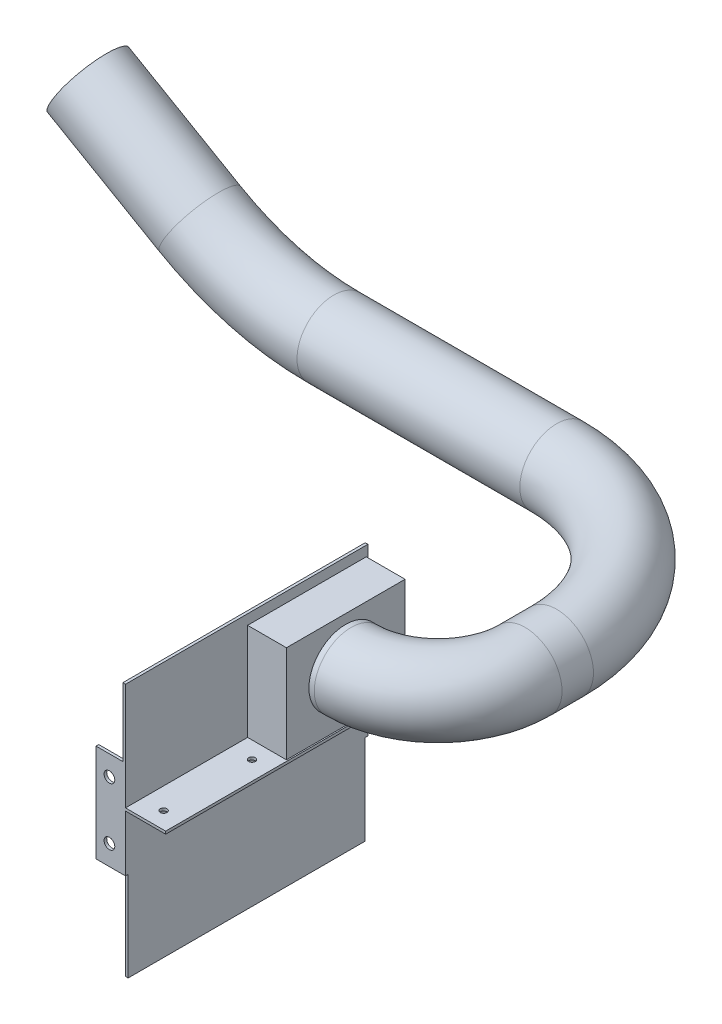
ISO-10303-21;
HEADER;
FILE_DESCRIPTION(('STEP AP214'),'2;1');
FILE_NAME('part.step','',(''),(''),'','','');
FILE_SCHEMA(('AUTOMOTIVE_DESIGN { 1 0 10303 214 1 1 1 1 }'));
ENDSEC;
DATA;
#1=APPLICATION_CONTEXT('core data for automotive mechanical design processes');
#2=APPLICATION_PROTOCOL_DEFINITION('international standard','automotive_design',2000,#1);
#3=PRODUCT_CONTEXT('',#1,'mechanical');
#4=PRODUCT('Part','Part','',(#3));
#5=PRODUCT_RELATED_PRODUCT_CATEGORY('part','',(#4));
#6=PRODUCT_DEFINITION_FORMATION('','',#4);
#7=PRODUCT_DEFINITION_CONTEXT('part definition',#1,'design');
#8=PRODUCT_DEFINITION('design','',#6,#7);
#9=PRODUCT_DEFINITION_SHAPE('','',#8);
#10=(LENGTH_UNIT() NAMED_UNIT(*) SI_UNIT(.MILLI.,.METRE.));
#11=(NAMED_UNIT(*) PLANE_ANGLE_UNIT() SI_UNIT($,.RADIAN.));
#12=(NAMED_UNIT(*) SI_UNIT($,.STERADIAN.) SOLID_ANGLE_UNIT());
#13=UNCERTAINTY_MEASURE_WITH_UNIT(LENGTH_MEASURE(1.E-05),#10,'distance_accuracy_value','');
#14=(GEOMETRIC_REPRESENTATION_CONTEXT(3) GLOBAL_UNCERTAINTY_ASSIGNED_CONTEXT((#13)) GLOBAL_UNIT_ASSIGNED_CONTEXT((#10,
#11,#12)) REPRESENTATION_CONTEXT('',''));
#15=CARTESIAN_POINT('',(0.,0.,0.));
#16=DIRECTION('',(0.,0.,1.));
#17=DIRECTION('',(1.,0.,0.));
#18=AXIS2_PLACEMENT_3D('',#15,#16,#17);
#19=CARTESIAN_POINT('',(31.,43.5,-0.7));
#20=DIRECTION('',(-1.,0.,0.));
#21=DIRECTION('',(0.,0.,1.));
#22=AXIS2_PLACEMENT_3D('',#19,#20,#21);
#23=PLANE('',#22);
#24=DIRECTION('',(0.,0.,-1.));
#25=VECTOR('',#24,1.);
#26=CARTESIAN_POINT('',(31.,-29.,-0.7));
#27=LINE('',#26,#25);
#28=CARTESIAN_POINT('',(31.,-29.,-0.699999999999992));
#29=VERTEX_POINT('',#28);
#30=CARTESIAN_POINT('',(31.,-29.,-89.3));
#31=VERTEX_POINT('',#30);
#32=EDGE_CURVE('E34',#29,#31,#27,.T.);
#33=ORIENTED_EDGE('',*,*,#32,.T.);
#34=DIRECTION('',(0.,-1.,0.));
#35=VECTOR('',#34,1.);
#36=CARTESIAN_POINT('',(31.,43.5,-89.3));
#37=LINE('',#36,#35);
#38=CARTESIAN_POINT('',(31.,43.5,-89.3));
#39=VERTEX_POINT('',#38);
#40=EDGE_CURVE('E193',#39,#31,#37,.T.);
#41=ORIENTED_EDGE('',*,*,#40,.F.);
#42=DIRECTION('',(0.,0.,-1.));
#43=VECTOR('',#42,1.);
#44=CARTESIAN_POINT('',(31.,43.5,-0.7));
#45=LINE('',#44,#43);
#46=CARTESIAN_POINT('',(31.,43.5,-0.7));
#47=VERTEX_POINT('',#46);
#48=EDGE_CURVE('E179',#47,#39,#45,.T.);
#49=ORIENTED_EDGE('',*,*,#48,.F.);
#50=DIRECTION('',(0.,-1.,0.));
#51=VECTOR('',#50,1.);
#52=CARTESIAN_POINT('',(31.,43.5,-0.7));
#53=LINE('',#52,#51);
#54=EDGE_CURVE('E171',#47,#29,#53,.T.);
#55=ORIENTED_EDGE('',*,*,#54,.T.);
#56=EDGE_LOOP('',(#33,#41,#49,#55));
#57=FACE_BOUND('',#56,.T.);
#58=CARTESIAN_POINT('',(31.,9.,-45.));
#59=DIRECTION('',(1.,0.,0.));
#60=DIRECTION('',(0.,0.,-1.));
#61=AXIS2_PLACEMENT_3D('',#58,#59,#60);
#62=CIRCLE('',#61,27.5);
#63=CARTESIAN_POINT('',(31.,9.,-72.5));
#64=VERTEX_POINT('',#63);
#65=EDGE_CURVE('E11',#64,#64,#62,.T.);
#66=ORIENTED_EDGE('',*,*,#65,.F.);
#67=EDGE_LOOP('',(#66));
#68=FACE_BOUND('',#67,.T.);
#69=ADVANCED_FACE('F17',(#57,#68),#23,.F.);
#70=CARTESIAN_POINT('',(-183.30848316431,-29.,90.5));
#71=DIRECTION('',(0.,-1.,0.));
#72=DIRECTION('',(0.,0.,-1.));
#73=AXIS2_PLACEMENT_3D('',#70,#71,#72);
#74=PLANE('',#73);
#75=CARTESIAN_POINT('',(18.,-29.,12.));
#76=DIRECTION('',(0.,1.,0.));
#77=DIRECTION('',(0.,0.,1.));
#78=AXIS2_PLACEMENT_3D('',#75,#76,#77);
#79=CIRCLE('',#78,2.5);
#80=CARTESIAN_POINT('',(18.,-29.,14.5));
#81=VERTEX_POINT('',#80);
#82=EDGE_CURVE('E241',#81,#81,#79,.T.);
#83=ORIENTED_EDGE('',*,*,#82,.F.);
#84=EDGE_LOOP('',(#83));
#85=FACE_BOUND('',#84,.T.);
#86=CARTESIAN_POINT('',(18.,-29.,78.));
#87=DIRECTION('',(0.,1.,0.));
#88=DIRECTION('',(0.,0.,1.));
#89=AXIS2_PLACEMENT_3D('',#86,#87,#88);
#90=CIRCLE('',#89,2.5);
#91=CARTESIAN_POINT('',(18.,-29.,80.5));
#92=VERTEX_POINT('',#91);
#93=EDGE_CURVE('E244',#92,#92,#90,.T.);
#94=ORIENTED_EDGE('',*,*,#93,.F.);
#95=EDGE_LOOP('',(#94));
#96=FACE_BOUND('',#95,.T.);
#97=DIRECTION('',(1.,0.,0.));
#98=VECTOR('',#97,1.);
#99=CARTESIAN_POINT('',(2.,-29.,-0.699999999999992));
#100=LINE('',#99,#98);
#101=CARTESIAN_POINT('',(2.,-29.,-0.699999999999992));
#102=VERTEX_POINT('',#101);
#103=EDGE_CURVE('E834',#102,#29,#100,.T.);
#104=ORIENTED_EDGE('',*,*,#103,.F.);
#105=DIRECTION('',(0.,0.,-1.));
#106=VECTOR('',#105,1.);
#107=CARTESIAN_POINT('',(2.,-29.,90.5));
#108=LINE('',#107,#106);
#109=CARTESIAN_POINT('',(2.,-29.,90.5));
#110=VERTEX_POINT('',#109);
#111=EDGE_CURVE('E168',#110,#102,#108,.T.);
#112=ORIENTED_EDGE('',*,*,#111,.F.);
#113=DIRECTION('',(1.,0.,0.));
#114=VECTOR('',#113,1.);
#115=CARTESIAN_POINT('',(-183.30848316431,-29.,90.5));
#116=LINE('',#115,#114);
#117=CARTESIAN_POINT('',(32.,-29.,90.5));
#118=VERTEX_POINT('',#117);
#119=EDGE_CURVE('E440',#110,#118,#116,.T.);
#120=ORIENTED_EDGE('',*,*,#119,.T.);
#121=DIRECTION('',(0.,0.,1.));
#122=VECTOR('',#121,1.);
#123=CARTESIAN_POINT('',(32.,-29.,90.5));
#124=LINE('',#123,#122);
#125=CARTESIAN_POINT('',(32.,-29.,-90.5));
#126=VERTEX_POINT('',#125);
#127=EDGE_CURVE('E264',#126,#118,#124,.T.);
#128=ORIENTED_EDGE('',*,*,#127,.F.);
#129=DIRECTION('',(1.,0.,0.));
#130=VECTOR('',#129,1.);
#131=CARTESIAN_POINT('',(-183.30848316431,-29.,-90.5));
#132=LINE('',#131,#130);
#133=CARTESIAN_POINT('',(2.,-29.,-90.5));
#134=VERTEX_POINT('',#133);
#135=EDGE_CURVE('E269',#134,#126,#132,.T.);
#136=ORIENTED_EDGE('',*,*,#135,.F.);
#137=CARTESIAN_POINT('',(2.,-29.,-89.3));
#138=VERTEX_POINT('',#137);
#139=EDGE_CURVE('E170',#138,#134,#108,.T.);
#140=ORIENTED_EDGE('',*,*,#139,.F.);
#141=DIRECTION('',(-1.,0.,0.));
#142=VECTOR('',#141,1.);
#143=CARTESIAN_POINT('',(2.,-29.,-89.3));
#144=LINE('',#143,#142);
#145=EDGE_CURVE('E39',#31,#138,#144,.T.);
#146=ORIENTED_EDGE('',*,*,#145,.F.);
#147=ORIENTED_EDGE('',*,*,#32,.F.);
#148=EDGE_LOOP('',(#104,#112,#120,#128,#136,#140,#146,#147));
#149=FACE_BOUND('',#148,.T.);
#150=ADVANCED_FACE('F294',(#85,#96,#149),#74,.F.);
#151=CARTESIAN_POINT('',(2.,51.,90.5));
#152=DIRECTION('',(-1.,0.,0.));
#153=DIRECTION('',(0.,0.,1.));
#154=AXIS2_PLACEMENT_3D('',#151,#152,#153);
#155=PLANE('',#154);
#156=DIRECTION('',(0.,-1.,0.));
#157=VECTOR('',#156,1.);
#158=CARTESIAN_POINT('',(2.,43.5,-0.699999999999992));
#159=LINE('',#158,#157);
#160=CARTESIAN_POINT('',(2.,43.5,-0.699999999999992));
#161=VERTEX_POINT('',#160);
#162=EDGE_CURVE('E161',#161,#102,#159,.T.);
#163=ORIENTED_EDGE('',*,*,#162,.F.);
#164=DIRECTION('',(0.,0.,1.));
#165=VECTOR('',#164,1.);
#166=CARTESIAN_POINT('',(2.,43.5,-0.699999999999992));
#167=LINE('',#166,#165);
#168=CARTESIAN_POINT('',(2.,43.5,-89.3));
#169=VERTEX_POINT('',#168);
#170=EDGE_CURVE('E165',#169,#161,#167,.T.);
#171=ORIENTED_EDGE('',*,*,#170,.F.);
#172=DIRECTION('',(0.,-1.,0.));
#173=VECTOR('',#172,1.);
#174=CARTESIAN_POINT('',(2.,43.5,-89.3));
#175=LINE('',#174,#173);
#176=EDGE_CURVE('E191',#169,#138,#175,.T.);
#177=ORIENTED_EDGE('',*,*,#176,.T.);
#178=ORIENTED_EDGE('',*,*,#139,.T.);
#179=DIRECTION('',(0.,-1.,0.));
#180=VECTOR('',#179,1.);
#181=CARTESIAN_POINT('',(2.,51.,-90.5));
#182=LINE('',#181,#180);
#183=CARTESIAN_POINT('',(2.,51.,-90.5));
#184=VERTEX_POINT('',#183);
#185=EDGE_CURVE('E212',#184,#134,#182,.T.);
#186=ORIENTED_EDGE('',*,*,#185,.F.);
#187=DIRECTION('',(0.,0.,-1.));
#188=VECTOR('',#187,1.);
#189=CARTESIAN_POINT('',(2.,51.,90.5));
#190=LINE('',#189,#188);
#191=CARTESIAN_POINT('',(2.,51.,90.5));
#192=VERTEX_POINT('',#191);
#193=EDGE_CURVE('E201',#192,#184,#190,.T.);
#194=ORIENTED_EDGE('',*,*,#193,.F.);
#195=DIRECTION('',(0.,-1.,0.));
#196=VECTOR('',#195,1.);
#197=CARTESIAN_POINT('',(2.,51.,90.5));
#198=LINE('',#197,#196);
#199=EDGE_CURVE('E215',#192,#110,#198,.T.);
#200=ORIENTED_EDGE('',*,*,#199,.T.);
#201=ORIENTED_EDGE('',*,*,#111,.T.);
#202=EDGE_LOOP('',(#163,#171,#177,#178,#186,#194,#200,#201));
#203=FACE_BOUND('',#202,.T.);
#204=ADVANCED_FACE('F163',(#203),#155,.F.);
#205=CARTESIAN_POINT('',(-20.,0.,90.5));
#206=DIRECTION('',(0.,1.,0.));
#207=DIRECTION('',(0.,0.,1.));
#208=AXIS2_PLACEMENT_3D('',#205,#206,#207);
#209=PLANE('',#208);
#210=DIRECTION('',(0.,0.,1.));
#211=VECTOR('',#210,1.);
#212=CARTESIAN_POINT('',(0.,0.,90.5));
#213=LINE('',#212,#211);
#214=CARTESIAN_POINT('',(0.,0.,-90.5));
#215=VERTEX_POINT('',#214);
#216=CARTESIAN_POINT('',(0.,0.,-88.5));
#217=VERTEX_POINT('',#216);
#218=EDGE_CURVE('E363',#215,#217,#213,.T.);
#219=ORIENTED_EDGE('',*,*,#218,.F.);
#220=DIRECTION('',(-1.,0.,0.));
#221=VECTOR('',#220,1.);
#222=CARTESIAN_POINT('',(2.,0.,-90.5));
#223=LINE('',#222,#221);
#224=CARTESIAN_POINT('',(-20.,0.,-90.5));
#225=VERTEX_POINT('',#224);
#226=EDGE_CURVE('E407',#215,#225,#223,.T.);
#227=ORIENTED_EDGE('',*,*,#226,.T.);
#228=DIRECTION('',(0.,0.,1.));
#229=VECTOR('',#228,1.);
#230=CARTESIAN_POINT('',(-20.,0.,-88.5));
#231=LINE('',#230,#229);
#232=CARTESIAN_POINT('',(-20.,0.,-88.5));
#233=VERTEX_POINT('',#232);
#234=EDGE_CURVE('E404',#225,#233,#231,.T.);
#235=ORIENTED_EDGE('',*,*,#234,.T.);
#236=DIRECTION('',(1.,0.,0.));
#237=VECTOR('',#236,1.);
#238=CARTESIAN_POINT('',(0.,0.,-88.5));
#239=LINE('',#238,#237);
#240=EDGE_CURVE('E402',#233,#217,#239,.T.);
#241=ORIENTED_EDGE('',*,*,#240,.T.);
#242=EDGE_LOOP('',(#219,#227,#235,#241));
#243=FACE_BOUND('',#242,.T.);
#244=ADVANCED_FACE('F316',(#243),#209,.T.);
#245=CARTESIAN_POINT('',(-20.,-140.,88.5));
#246=DIRECTION('',(-1.,0.,0.));
#247=DIRECTION('',(0.,0.,1.));
#248=AXIS2_PLACEMENT_3D('',#245,#246,#247);
#249=PLANE('',#248);
#250=DIRECTION('',(0.,0.,1.));
#251=VECTOR('',#250,1.);
#252=CARTESIAN_POINT('',(-20.,-73.,17.980499150944));
#253=LINE('',#252,#251);
#254=CARTESIAN_POINT('',(-20.,-73.,88.5));
#255=VERTEX_POINT('',#254);
#256=CARTESIAN_POINT('',(-20.,-73.,90.5));
#257=VERTEX_POINT('',#256);
#258=EDGE_CURVE('E429',#255,#257,#253,.T.);
#259=ORIENTED_EDGE('',*,*,#258,.T.);
#260=DIRECTION('',(0.,1.,0.));
#261=VECTOR('',#260,1.);
#262=CARTESIAN_POINT('',(-20.,-140.,90.5));
#263=LINE('',#262,#261);
#264=CARTESIAN_POINT('',(-20.,0.,90.5));
#265=VERTEX_POINT('',#264);
#266=EDGE_CURVE('E378',#257,#265,#263,.T.);
#267=ORIENTED_EDGE('',*,*,#266,.T.);
#268=DIRECTION('',(0.,0.,1.));
#269=VECTOR('',#268,1.);
#270=CARTESIAN_POINT('',(-20.,0.,88.5));
#271=LINE('',#270,#269);
#272=CARTESIAN_POINT('',(-20.,0.,88.5));
#273=VERTEX_POINT('',#272);
#274=EDGE_CURVE('E412',#273,#265,#271,.T.);
#275=ORIENTED_EDGE('',*,*,#274,.F.);
#276=DIRECTION('',(0.,1.,0.));
#277=VECTOR('',#276,1.);
#278=CARTESIAN_POINT('',(-20.,-140.,88.5));
#279=LINE('',#278,#277);
#280=EDGE_CURVE('E385',#255,#273,#279,.T.);
#281=ORIENTED_EDGE('',*,*,#280,.F.);
#282=EDGE_LOOP('',(#259,#267,#275,#281));
#283=FACE_BOUND('',#282,.T.);
#284=ADVANCED_FACE('F19',(#283),#249,.T.);
#285=CARTESIAN_POINT('',(-20.,-140.,88.5));
#286=DIRECTION('',(0.,0.,-1.));
#287=DIRECTION('',(-1.,0.,0.));
#288=AXIS2_PLACEMENT_3D('',#285,#286,#287);
#289=PLANE('',#288);
#290=CARTESIAN_POINT('',(-10.,-58.,88.5));
#291=DIRECTION('',(0.,0.,-1.));
#292=DIRECTION('',(-1.,0.,0.));
#293=AXIS2_PLACEMENT_3D('',#290,#291,#292);
#294=CIRCLE('',#293,4.);
#295=CARTESIAN_POINT('',(-14.,-58.,88.5));
#296=VERTEX_POINT('',#295);
#297=EDGE_CURVE('E220',#296,#296,#294,.T.);
#298=ORIENTED_EDGE('',*,*,#297,.F.);
#299=EDGE_LOOP('',(#298));
#300=FACE_BOUND('',#299,.T.);
#301=CARTESIAN_POINT('',(-10.,-15.,88.5));
#302=DIRECTION('',(0.,0.,-1.));
#303=DIRECTION('',(-1.,0.,0.));
#304=AXIS2_PLACEMENT_3D('',#301,#302,#303);
#305=CIRCLE('',#304,4.);
#306=CARTESIAN_POINT('',(-14.,-15.,88.5));
#307=VERTEX_POINT('',#306);
#308=EDGE_CURVE('E226',#307,#307,#305,.T.);
#309=ORIENTED_EDGE('',*,*,#308,.F.);
#310=EDGE_LOOP('',(#309));
#311=FACE_BOUND('',#310,.T.);
#312=DIRECTION('',(-1.,0.,0.));
#313=VECTOR('',#312,1.);
#314=CARTESIAN_POINT('',(2.,-73.,88.5));
#315=LINE('',#314,#313);
#316=CARTESIAN_POINT('',(0.,-73.,88.5));
#317=VERTEX_POINT('',#316);
#318=EDGE_CURVE('E437',#317,#255,#315,.T.);
#319=ORIENTED_EDGE('',*,*,#318,.T.);
#320=ORIENTED_EDGE('',*,*,#280,.T.);
#321=DIRECTION('',(-1.,0.,0.));
#322=VECTOR('',#321,1.);
#323=CARTESIAN_POINT('',(-20.,0.,88.5));
#324=LINE('',#323,#322);
#325=CARTESIAN_POINT('',(0.,0.,88.5));
#326=VERTEX_POINT('',#325);
#327=EDGE_CURVE('E399',#326,#273,#324,.T.);
#328=ORIENTED_EDGE('',*,*,#327,.F.);
#329=DIRECTION('',(0.,1.,0.));
#330=VECTOR('',#329,1.);
#331=CARTESIAN_POINT('',(0.,-140.,88.5));
#332=LINE('',#331,#330);
#333=EDGE_CURVE('E366',#317,#326,#332,.T.);
#334=ORIENTED_EDGE('',*,*,#333,.F.);
#335=EDGE_LOOP('',(#319,#320,#328,#334));
#336=FACE_BOUND('',#335,.T.);
#337=ADVANCED_FACE('F496',(#300,#311,#336),#289,.T.);
#338=CARTESIAN_POINT('',(0.,-140.,88.5));
#339=DIRECTION('',(-1.,0.,0.));
#340=DIRECTION('',(0.,0.,1.));
#341=AXIS2_PLACEMENT_3D('',#338,#339,#340);
#342=PLANE('',#341);
#343=ORIENTED_EDGE('',*,*,#333,.T.);
#344=DIRECTION('',(0.,0.,1.));
#345=VECTOR('',#344,1.);
#346=CARTESIAN_POINT('',(0.,0.,90.5));
#347=LINE('',#346,#345);
#348=CARTESIAN_POINT('',(0.,0.,90.5));
#349=VERTEX_POINT('',#348);
#350=EDGE_CURVE('E26',#326,#349,#347,.T.);
#351=ORIENTED_EDGE('',*,*,#350,.T.);
#352=DIRECTION('',(0.,-1.,0.));
#353=VECTOR('',#352,1.);
#354=CARTESIAN_POINT('',(0.,51.,90.5));
#355=LINE('',#354,#353);
#356=CARTESIAN_POINT('',(0.,51.,90.5));
#357=VERTEX_POINT('',#356);
#358=EDGE_CURVE('E207',#357,#349,#355,.T.);
#359=ORIENTED_EDGE('',*,*,#358,.F.);
#360=DIRECTION('',(0.,0.,1.));
#361=VECTOR('',#360,1.);
#362=CARTESIAN_POINT('',(0.,51.,90.5));
#363=LINE('',#362,#361);
#364=CARTESIAN_POINT('',(0.,51.,-90.5));
#365=VERTEX_POINT('',#364);
#366=EDGE_CURVE('E205',#365,#357,#363,.T.);
#367=ORIENTED_EDGE('',*,*,#366,.F.);
#368=DIRECTION('',(0.,-1.,0.));
#369=VECTOR('',#368,1.);
#370=CARTESIAN_POINT('',(0.,51.,-90.5));
#371=LINE('',#370,#369);
#372=EDGE_CURVE('E210',#365,#215,#371,.T.);
#373=ORIENTED_EDGE('',*,*,#372,.T.);
#374=ORIENTED_EDGE('',*,*,#218,.T.);
#375=DIRECTION('',(0.,1.,0.));
#376=VECTOR('',#375,1.);
#377=CARTESIAN_POINT('',(0.,-140.,-88.5));
#378=LINE('',#377,#376);
#379=CARTESIAN_POINT('',(0.,-73.,-88.5));
#380=VERTEX_POINT('',#379);
#381=EDGE_CURVE('E348',#380,#217,#378,.T.);
#382=ORIENTED_EDGE('',*,*,#381,.F.);
#383=CARTESIAN_POINT('',(0.,-140.,-88.5));
#384=VERTEX_POINT('',#383);
#385=EDGE_CURVE('E360',#384,#380,#378,.T.);
#386=ORIENTED_EDGE('',*,*,#385,.F.);
#387=DIRECTION('',(0.,0.,1.));
#388=VECTOR('',#387,1.);
#389=CARTESIAN_POINT('',(0.,-140.,88.5));
#390=LINE('',#389,#388);
#391=CARTESIAN_POINT('',(0.,-140.,88.5));
#392=VERTEX_POINT('',#391);
#393=EDGE_CURVE('E395',#384,#392,#390,.T.);
#394=ORIENTED_EDGE('',*,*,#393,.T.);
#395=EDGE_CURVE('E370',#392,#317,#332,.T.);
#396=ORIENTED_EDGE('',*,*,#395,.T.);
#397=EDGE_LOOP('',(#343,#351,#359,#367,#373,#374,#382,#386,#394,#396));
#398=FACE_BOUND('',#397,.T.);
#399=ADVANCED_FACE('F340',(#398),#342,.T.);
#400=CARTESIAN_POINT('',(0.,-140.,-88.5));
#401=DIRECTION('',(0.,0.,1.));
#402=DIRECTION('',(1.,0.,0.));
#403=AXIS2_PLACEMENT_3D('',#400,#401,#402);
#404=PLANE('',#403);
#405=CARTESIAN_POINT('',(-10.,-15.,-88.5));
#406=DIRECTION('',(0.,0.,1.));
#407=DIRECTION('',(1.,0.,0.));
#408=AXIS2_PLACEMENT_3D('',#405,#406,#407);
#409=CIRCLE('',#408,4.);
#410=CARTESIAN_POINT('',(-6.,-15.,-88.5));
#411=VERTEX_POINT('',#410);
#412=EDGE_CURVE('E232',#411,#411,#409,.T.);
#413=ORIENTED_EDGE('',*,*,#412,.F.);
#414=EDGE_LOOP('',(#413));
#415=FACE_BOUND('',#414,.T.);
#416=CARTESIAN_POINT('',(-10.,-58.,-88.5));
#417=DIRECTION('',(0.,0.,1.));
#418=DIRECTION('',(1.,0.,0.));
#419=AXIS2_PLACEMENT_3D('',#416,#417,#418);
#420=CIRCLE('',#419,4.);
#421=CARTESIAN_POINT('',(-6.,-58.,-88.5));
#422=VERTEX_POINT('',#421);
#423=EDGE_CURVE('E238',#422,#422,#420,.T.);
#424=ORIENTED_EDGE('',*,*,#423,.F.);
#425=EDGE_LOOP('',(#424));
#426=FACE_BOUND('',#425,.T.);
#427=DIRECTION('',(1.,0.,0.));
#428=VECTOR('',#427,1.);
#429=CARTESIAN_POINT('',(2.,-73.,-88.5));
#430=LINE('',#429,#428);
#431=CARTESIAN_POINT('',(-20.,-73.,-88.5));
#432=VERTEX_POINT('',#431);
#433=EDGE_CURVE('E345',#432,#380,#430,.T.);
#434=ORIENTED_EDGE('',*,*,#433,.T.);
#435=ORIENTED_EDGE('',*,*,#381,.T.);
#436=ORIENTED_EDGE('',*,*,#240,.F.);
#437=DIRECTION('',(0.,1.,0.));
#438=VECTOR('',#437,1.);
#439=CARTESIAN_POINT('',(-20.,-140.,-88.5));
#440=LINE('',#439,#438);
#441=EDGE_CURVE('E350',#432,#233,#440,.T.);
#442=ORIENTED_EDGE('',*,*,#441,.F.);
#443=EDGE_LOOP('',(#434,#435,#436,#442));
#444=FACE_BOUND('',#443,.T.);
#445=ADVANCED_FACE('F337',(#415,#426,#444),#404,.T.);
#446=CARTESIAN_POINT('',(-20.,-140.,-88.5));
#447=DIRECTION('',(-1.,0.,0.));
#448=DIRECTION('',(0.,0.,1.));
#449=AXIS2_PLACEMENT_3D('',#446,#447,#448);
#450=PLANE('',#449);
#451=DIRECTION('',(0.,0.,-1.));
#452=VECTOR('',#451,1.);
#453=CARTESIAN_POINT('',(-20.,-73.,-17.980499150944));
#454=LINE('',#453,#452);
#455=CARTESIAN_POINT('',(-20.,-73.,-90.5));
#456=VERTEX_POINT('',#455);
#457=EDGE_CURVE('E416',#432,#456,#454,.T.);
#458=ORIENTED_EDGE('',*,*,#457,.F.);
#459=ORIENTED_EDGE('',*,*,#441,.T.);
#460=ORIENTED_EDGE('',*,*,#234,.F.);
#461=DIRECTION('',(0.,1.,0.));
#462=VECTOR('',#461,1.);
#463=CARTESIAN_POINT('',(-20.,-140.,-90.5));
#464=LINE('',#463,#462);
#465=EDGE_CURVE('E367',#456,#225,#464,.T.);
#466=ORIENTED_EDGE('',*,*,#465,.F.);
#467=EDGE_LOOP('',(#458,#459,#460,#466));
#468=FACE_BOUND('',#467,.T.);
#469=ADVANCED_FACE('F339',(#468),#450,.T.);
#470=CARTESIAN_POINT('',(2.,-140.,-90.5));
#471=DIRECTION('',(0.,0.,-1.));
#472=DIRECTION('',(-1.,0.,0.));
#473=AXIS2_PLACEMENT_3D('',#470,#471,#472);
#474=PLANE('',#473);
#475=ORIENTED_EDGE('',*,*,#226,.F.);
#476=ORIENTED_EDGE('',*,*,#372,.F.);
#477=DIRECTION('',(-1.,0.,0.));
#478=VECTOR('',#477,1.);
#479=CARTESIAN_POINT('',(0.,51.,-90.5));
#480=LINE('',#479,#478);
#481=EDGE_CURVE('E203',#184,#365,#480,.T.);
#482=ORIENTED_EDGE('',*,*,#481,.F.);
#483=ORIENTED_EDGE('',*,*,#185,.T.);
#484=ORIENTED_EDGE('',*,*,#135,.T.);
#485=DIRECTION('',(0.,1.,0.));
#486=VECTOR('',#485,1.);
#487=CARTESIAN_POINT('',(32.,-29.,-90.5));
#488=LINE('',#487,#486);
#489=CARTESIAN_POINT('',(32.,-31.,-90.5));
#490=VERTEX_POINT('',#489);
#491=EDGE_CURVE('E446',#490,#126,#488,.T.);
#492=ORIENTED_EDGE('',*,*,#491,.F.);
#493=DIRECTION('',(-1.,0.,0.));
#494=VECTOR('',#493,1.);
#495=CARTESIAN_POINT('',(32.,-31.,-90.5));
#496=LINE('',#495,#494);
#497=CARTESIAN_POINT('',(2.,-31.,-90.5));
#498=VERTEX_POINT('',#497);
#499=EDGE_CURVE('E260',#490,#498,#496,.T.);
#500=ORIENTED_EDGE('',*,*,#499,.T.);
#501=DIRECTION('',(0.,1.,0.));
#502=VECTOR('',#501,1.);
#503=CARTESIAN_POINT('',(2.,-140.,-90.5));
#504=LINE('',#503,#502);
#505=CARTESIAN_POINT('',(2.,-73.,-90.5));
#506=VERTEX_POINT('',#505);
#507=EDGE_CURVE('E257',#506,#498,#504,.T.);
#508=ORIENTED_EDGE('',*,*,#507,.F.);
#509=DIRECTION('',(1.,0.,0.));
#510=VECTOR('',#509,1.);
#511=CARTESIAN_POINT('',(2.,-73.,-90.5));
#512=LINE('',#511,#510);
#513=EDGE_CURVE('E424',#456,#506,#512,.T.);
#514=ORIENTED_EDGE('',*,*,#513,.F.);
#515=ORIENTED_EDGE('',*,*,#465,.T.);
#516=EDGE_LOOP('',(#475,#476,#482,#483,#484,#492,#500,#508,#514,#515));
#517=FACE_BOUND('',#516,.T.);
#518=CARTESIAN_POINT('',(-10.,-15.,-90.5));
#519=DIRECTION('',(0.,0.,-1.));
#520=DIRECTION('',(-1.,0.,0.));
#521=AXIS2_PLACEMENT_3D('',#518,#519,#520);
#522=CIRCLE('',#521,4.);
#523=CARTESIAN_POINT('',(-14.,-15.,-90.5));
#524=VERTEX_POINT('',#523);
#525=EDGE_CURVE('E229',#524,#524,#522,.T.);
#526=ORIENTED_EDGE('',*,*,#525,.F.);
#527=EDGE_LOOP('',(#526));
#528=FACE_BOUND('',#527,.T.);
#529=CARTESIAN_POINT('',(-10.,-58.,-90.5));
#530=DIRECTION('',(0.,0.,-1.));
#531=DIRECTION('',(-1.,0.,0.));
#532=AXIS2_PLACEMENT_3D('',#529,#530,#531);
#533=CIRCLE('',#532,4.);
#534=CARTESIAN_POINT('',(-14.,-58.,-90.5));
#535=VERTEX_POINT('',#534);
#536=EDGE_CURVE('E235',#535,#535,#533,.T.);
#537=ORIENTED_EDGE('',*,*,#536,.F.);
#538=EDGE_LOOP('',(#537));
#539=FACE_BOUND('',#538,.T.);
#540=ADVANCED_FACE('F463',(#517,#528,#539),#474,.T.);
#541=CARTESIAN_POINT('',(2.,-140.,90.5));
#542=DIRECTION('',(1.,0.,0.));
#543=DIRECTION('',(0.,0.,-1.));
#544=AXIS2_PLACEMENT_3D('',#541,#542,#543);
#545=PLANE('',#544);
#546=DIRECTION('',(0.,0.,-1.));
#547=VECTOR('',#546,1.);
#548=CARTESIAN_POINT('',(2.,-31.,90.5));
#549=LINE('',#548,#547);
#550=CARTESIAN_POINT('',(2.,-31.,90.5));
#551=VERTEX_POINT('',#550);
#552=EDGE_CURVE('E253',#551,#498,#549,.T.);
#553=ORIENTED_EDGE('',*,*,#552,.F.);
#554=DIRECTION('',(0.,1.,0.));
#555=VECTOR('',#554,1.);
#556=CARTESIAN_POINT('',(2.,-140.,90.5));
#557=LINE('',#556,#555);
#558=CARTESIAN_POINT('',(2.,-73.,90.5));
#559=VERTEX_POINT('',#558);
#560=EDGE_CURVE('E380',#559,#551,#557,.T.);
#561=ORIENTED_EDGE('',*,*,#560,.F.);
#562=DIRECTION('',(0.,0.,1.));
#563=VECTOR('',#562,1.);
#564=CARTESIAN_POINT('',(2.,-73.,17.980499150944));
#565=LINE('',#564,#563);
#566=CARTESIAN_POINT('',(2.,-73.,88.5));
#567=VERTEX_POINT('',#566);
#568=EDGE_CURVE('E426',#567,#559,#565,.T.);
#569=ORIENTED_EDGE('',*,*,#568,.F.);
#570=DIRECTION('',(0.,1.,0.));
#571=VECTOR('',#570,1.);
#572=CARTESIAN_POINT('',(2.,-140.,88.5));
#573=LINE('',#572,#571);
#574=CARTESIAN_POINT('',(2.,-140.,88.5));
#575=VERTEX_POINT('',#574);
#576=EDGE_CURVE('E428',#575,#567,#573,.T.);
#577=ORIENTED_EDGE('',*,*,#576,.F.);
#578=DIRECTION('',(0.,0.,-1.));
#579=VECTOR('',#578,1.);
#580=CARTESIAN_POINT('',(2.,-140.,90.5));
#581=LINE('',#580,#579);
#582=CARTESIAN_POINT('',(2.,-140.,-88.5));
#583=VERTEX_POINT('',#582);
#584=EDGE_CURVE('E397',#575,#583,#581,.T.);
#585=ORIENTED_EDGE('',*,*,#584,.T.);
#586=DIRECTION('',(0.,-1.,0.));
#587=VECTOR('',#586,1.);
#588=CARTESIAN_POINT('',(2.,-140.,-88.5));
#589=LINE('',#588,#587);
#590=CARTESIAN_POINT('',(2.,-73.,-88.5));
#591=VERTEX_POINT('',#590);
#592=EDGE_CURVE('E415',#591,#583,#589,.T.);
#593=ORIENTED_EDGE('',*,*,#592,.F.);
#594=DIRECTION('',(0.,0.,-1.));
#595=VECTOR('',#594,1.);
#596=CARTESIAN_POINT('',(2.,-73.,-17.980499150944));
#597=LINE('',#596,#595);
#598=EDGE_CURVE('E354',#591,#506,#597,.T.);
#599=ORIENTED_EDGE('',*,*,#598,.T.);
#600=ORIENTED_EDGE('',*,*,#507,.T.);
#601=EDGE_LOOP('',(#553,#561,#569,#577,#585,#593,#599,#600));
#602=FACE_BOUND('',#601,.T.);
#603=ADVANCED_FACE('F482',(#602),#545,.T.);
#604=CARTESIAN_POINT('',(-20.,-140.,90.5));
#605=DIRECTION('',(0.,0.,1.));
#606=DIRECTION('',(1.,0.,0.));
#607=AXIS2_PLACEMENT_3D('',#604,#605,#606);
#608=PLANE('',#607);
#609=CARTESIAN_POINT('',(-10.,-58.,90.5));
#610=DIRECTION('',(0.,0.,1.));
#611=DIRECTION('',(1.,0.,0.));
#612=AXIS2_PLACEMENT_3D('',#609,#610,#611);
#613=CIRCLE('',#612,4.);
#614=CARTESIAN_POINT('',(-6.,-58.,90.5));
#615=VERTEX_POINT('',#614);
#616=EDGE_CURVE('E217',#615,#615,#613,.T.);
#617=ORIENTED_EDGE('',*,*,#616,.F.);
#618=EDGE_LOOP('',(#617));
#619=FACE_BOUND('',#618,.T.);
#620=CARTESIAN_POINT('',(-10.,-15.,90.5));
#621=DIRECTION('',(0.,0.,1.));
#622=DIRECTION('',(1.,0.,0.));
#623=AXIS2_PLACEMENT_3D('',#620,#621,#622);
#624=CIRCLE('',#623,4.);
#625=CARTESIAN_POINT('',(-6.,-15.,90.5));
#626=VERTEX_POINT('',#625);
#627=EDGE_CURVE('E223',#626,#626,#624,.T.);
#628=ORIENTED_EDGE('',*,*,#627,.F.);
#629=EDGE_LOOP('',(#628));
#630=FACE_BOUND('',#629,.T.);
#631=ORIENTED_EDGE('',*,*,#358,.T.);
#632=DIRECTION('',(1.,0.,0.));
#633=VECTOR('',#632,1.);
#634=CARTESIAN_POINT('',(-20.,0.,90.5));
#635=LINE('',#634,#633);
#636=EDGE_CURVE('E409',#265,#349,#635,.T.);
#637=ORIENTED_EDGE('',*,*,#636,.F.);
#638=ORIENTED_EDGE('',*,*,#266,.F.);
#639=DIRECTION('',(-1.,0.,0.));
#640=VECTOR('',#639,1.);
#641=CARTESIAN_POINT('',(2.,-73.,90.5));
#642=LINE('',#641,#640);
#643=EDGE_CURVE('E438',#559,#257,#642,.T.);
#644=ORIENTED_EDGE('',*,*,#643,.F.);
#645=ORIENTED_EDGE('',*,*,#560,.T.);
#646=DIRECTION('',(-1.,0.,0.));
#647=VECTOR('',#646,1.);
#648=CARTESIAN_POINT('',(32.,-31.,90.5));
#649=LINE('',#648,#647);
#650=CARTESIAN_POINT('',(32.,-31.,90.5));
#651=VERTEX_POINT('',#650);
#652=EDGE_CURVE('E263',#651,#551,#649,.T.);
#653=ORIENTED_EDGE('',*,*,#652,.F.);
#654=DIRECTION('',(0.,-1.,0.));
#655=VECTOR('',#654,1.);
#656=CARTESIAN_POINT('',(32.,-29.,90.5));
#657=LINE('',#656,#655);
#658=EDGE_CURVE('E250',#118,#651,#657,.T.);
#659=ORIENTED_EDGE('',*,*,#658,.F.);
#660=ORIENTED_EDGE('',*,*,#119,.F.);
#661=ORIENTED_EDGE('',*,*,#199,.F.);
#662=DIRECTION('',(1.,0.,0.));
#663=VECTOR('',#662,1.);
#664=CARTESIAN_POINT('',(0.,51.,90.5));
#665=LINE('',#664,#663);
#666=EDGE_CURVE('E198',#357,#192,#665,.T.);
#667=ORIENTED_EDGE('',*,*,#666,.F.);
#668=EDGE_LOOP('',(#631,#637,#638,#644,#645,#653,#659,#660,#661,#667));
#669=FACE_BOUND('',#668,.T.);
#670=ADVANCED_FACE('F456',(#619,#630,#669),#608,.T.);
#671=CARTESIAN_POINT('',(-20.,-140.,90.5));
#672=DIRECTION('',(0.,1.,0.));
#673=DIRECTION('',(0.,0.,1.));
#674=AXIS2_PLACEMENT_3D('',#671,#672,#673);
#675=PLANE('',#674);
#676=ORIENTED_EDGE('',*,*,#584,.F.);
#677=DIRECTION('',(-1.,0.,0.));
#678=VECTOR('',#677,1.);
#679=CARTESIAN_POINT('',(-20.,-140.,88.5));
#680=LINE('',#679,#678);
#681=EDGE_CURVE('E383',#575,#392,#680,.T.);
#682=ORIENTED_EDGE('',*,*,#681,.T.);
#683=ORIENTED_EDGE('',*,*,#393,.F.);
#684=DIRECTION('',(-1.,0.,0.));
#685=VECTOR('',#684,1.);
#686=CARTESIAN_POINT('',(2.,-140.,-88.5));
#687=LINE('',#686,#685);
#688=EDGE_CURVE('E418',#583,#384,#687,.T.);
#689=ORIENTED_EDGE('',*,*,#688,.F.);
#690=EDGE_LOOP('',(#676,#682,#683,#689));
#691=FACE_BOUND('',#690,.T.);
#692=ADVANCED_FACE('F501',(#691),#675,.F.);
#693=ORIENTED_EDGE('',*,*,#350,.F.);
#694=ORIENTED_EDGE('',*,*,#327,.T.);
#695=ORIENTED_EDGE('',*,*,#274,.T.);
#696=ORIENTED_EDGE('',*,*,#636,.T.);
#697=EDGE_LOOP('',(#693,#694,#695,#696));
#698=FACE_BOUND('',#697,.T.);
#699=ADVANCED_FACE('F477',(#698),#209,.T.);
#700=CARTESIAN_POINT('',(0.,-140.,-88.5));
#701=DIRECTION('',(0.,0.,1.));
#702=DIRECTION('',(1.,0.,0.));
#703=AXIS2_PLACEMENT_3D('',#700,#701,#702);
#704=PLANE('',#703);
#705=ORIENTED_EDGE('',*,*,#385,.T.);
#706=EDGE_CURVE('E355',#380,#591,#430,.T.);
#707=ORIENTED_EDGE('',*,*,#706,.T.);
#708=ORIENTED_EDGE('',*,*,#592,.T.);
#709=ORIENTED_EDGE('',*,*,#688,.T.);
#710=EDGE_LOOP('',(#705,#707,#708,#709));
#711=FACE_BOUND('',#710,.T.);
#712=ADVANCED_FACE('F500',(#711),#704,.F.);
#713=CARTESIAN_POINT('',(2.,-73.,-17.980499150944));
#714=DIRECTION('',(0.,1.,0.));
#715=DIRECTION('',(0.,0.,1.));
#716=AXIS2_PLACEMENT_3D('',#713,#714,#715);
#717=PLANE('',#716);
#718=ORIENTED_EDGE('',*,*,#457,.T.);
#719=ORIENTED_EDGE('',*,*,#513,.T.);
#720=ORIENTED_EDGE('',*,*,#598,.F.);
#721=ORIENTED_EDGE('',*,*,#706,.F.);
#722=ORIENTED_EDGE('',*,*,#433,.F.);
#723=EDGE_LOOP('',(#718,#719,#720,#721,#722));
#724=FACE_BOUND('',#723,.T.);
#725=ADVANCED_FACE('F505',(#724),#717,.F.);
#726=CARTESIAN_POINT('',(-20.,-140.,88.5));
#727=DIRECTION('',(0.,0.,-1.));
#728=DIRECTION('',(-1.,0.,0.));
#729=AXIS2_PLACEMENT_3D('',#726,#727,#728);
#730=PLANE('',#729);
#731=ORIENTED_EDGE('',*,*,#395,.F.);
#732=ORIENTED_EDGE('',*,*,#681,.F.);
#733=ORIENTED_EDGE('',*,*,#576,.T.);
#734=EDGE_CURVE('E432',#567,#317,#315,.T.);
#735=ORIENTED_EDGE('',*,*,#734,.T.);
#736=EDGE_LOOP('',(#731,#732,#733,#735));
#737=FACE_BOUND('',#736,.T.);
#738=ADVANCED_FACE('F537',(#737),#730,.F.);
#739=CARTESIAN_POINT('',(2.,-73.,17.980499150944));
#740=DIRECTION('',(0.,1.,0.));
#741=DIRECTION('',(0.,0.,1.));
#742=AXIS2_PLACEMENT_3D('',#739,#740,#741);
#743=PLANE('',#742);
#744=ORIENTED_EDGE('',*,*,#568,.T.);
#745=ORIENTED_EDGE('',*,*,#643,.T.);
#746=ORIENTED_EDGE('',*,*,#258,.F.);
#747=ORIENTED_EDGE('',*,*,#318,.F.);
#748=ORIENTED_EDGE('',*,*,#734,.F.);
#749=EDGE_LOOP('',(#744,#745,#746,#747,#748));
#750=FACE_BOUND('',#749,.T.);
#751=ADVANCED_FACE('F545',(#750),#743,.F.);
#752=CARTESIAN_POINT('',(32.,-31.,90.5));
#753=DIRECTION('',(0.,1.,0.));
#754=DIRECTION('',(0.,0.,1.));
#755=AXIS2_PLACEMENT_3D('',#752,#753,#754);
#756=PLANE('',#755);
#757=CARTESIAN_POINT('',(18.,-31.,12.));
#758=DIRECTION('',(0.,1.,0.));
#759=DIRECTION('',(0.,0.,1.));
#760=AXIS2_PLACEMENT_3D('',#757,#758,#759);
#761=CIRCLE('',#760,2.5);
#762=CARTESIAN_POINT('',(18.,-31.,14.5));
#763=VERTEX_POINT('',#762);
#764=EDGE_CURVE('E21',#763,#763,#761,.T.);
#765=ORIENTED_EDGE('',*,*,#764,.T.);
#766=EDGE_LOOP('',(#765));
#767=FACE_BOUND('',#766,.T.);
#768=CARTESIAN_POINT('',(18.,-31.,78.));
#769=DIRECTION('',(0.,1.,0.));
#770=DIRECTION('',(0.,0.,1.));
#771=AXIS2_PLACEMENT_3D('',#768,#769,#770);
#772=CIRCLE('',#771,2.5);
#773=CARTESIAN_POINT('',(18.,-31.,80.5));
#774=VERTEX_POINT('',#773);
#775=EDGE_CURVE('E247',#774,#774,#772,.T.);
#776=ORIENTED_EDGE('',*,*,#775,.T.);
#777=EDGE_LOOP('',(#776));
#778=FACE_BOUND('',#777,.T.);
#779=ORIENTED_EDGE('',*,*,#552,.T.);
#780=ORIENTED_EDGE('',*,*,#499,.F.);
#781=DIRECTION('',(0.,0.,-1.));
#782=VECTOR('',#781,1.);
#783=CARTESIAN_POINT('',(32.,-31.,90.5));
#784=LINE('',#783,#782);
#785=EDGE_CURVE('E448',#651,#490,#784,.T.);
#786=ORIENTED_EDGE('',*,*,#785,.F.);
#787=ORIENTED_EDGE('',*,*,#652,.T.);
#788=EDGE_LOOP('',(#779,#780,#786,#787));
#789=FACE_BOUND('',#788,.T.);
#790=ADVANCED_FACE('F274',(#767,#778,#789),#756,.F.);
#791=CARTESIAN_POINT('',(32.,-31.,90.5));
#792=DIRECTION('',(1.,0.,0.));
#793=DIRECTION('',(0.,0.,-1.));
#794=AXIS2_PLACEMENT_3D('',#791,#792,#793);
#795=PLANE('',#794);
#796=ORIENTED_EDGE('',*,*,#658,.T.);
#797=ORIENTED_EDGE('',*,*,#785,.T.);
#798=ORIENTED_EDGE('',*,*,#491,.T.);
#799=ORIENTED_EDGE('',*,*,#127,.T.);
#800=EDGE_LOOP('',(#796,#797,#798,#799));
#801=FACE_BOUND('',#800,.T.);
#802=ADVANCED_FACE('F280',(#801),#795,.T.);
#803=CARTESIAN_POINT('',(18.,-29.,78.));
#804=DIRECTION('',(0.,1.,0.));
#805=DIRECTION('',(0.,0.,1.));
#806=AXIS2_PLACEMENT_3D('',#803,#804,#805);
#807=CYLINDRICAL_SURFACE('',#806,2.5);
#808=ORIENTED_EDGE('',*,*,#93,.T.);
#809=EDGE_LOOP('',(#808));
#810=FACE_BOUND('',#809,.T.);
#811=ORIENTED_EDGE('',*,*,#775,.F.);
#812=EDGE_LOOP('',(#811));
#813=FACE_BOUND('',#812,.T.);
#814=ADVANCED_FACE('F277',(#810,#813),#807,.F.);
#815=CARTESIAN_POINT('',(18.,-29.,12.));
#816=DIRECTION('',(0.,1.,0.));
#817=DIRECTION('',(0.,0.,1.));
#818=AXIS2_PLACEMENT_3D('',#815,#816,#817);
#819=CYLINDRICAL_SURFACE('',#818,2.5);
#820=ORIENTED_EDGE('',*,*,#82,.T.);
#821=EDGE_LOOP('',(#820));
#822=FACE_BOUND('',#821,.T.);
#823=ORIENTED_EDGE('',*,*,#764,.F.);
#824=EDGE_LOOP('',(#823));
#825=FACE_BOUND('',#824,.T.);
#826=ADVANCED_FACE('F279',(#822,#825),#819,.F.);
#827=CARTESIAN_POINT('',(-10.,-58.,-90.5));
#828=DIRECTION('',(0.,0.,-1.));
#829=DIRECTION('',(-1.,0.,0.));
#830=AXIS2_PLACEMENT_3D('',#827,#828,#829);
#831=CYLINDRICAL_SURFACE('',#830,4.);
#832=ORIENTED_EDGE('',*,*,#536,.T.);
#833=EDGE_LOOP('',(#832));
#834=FACE_BOUND('',#833,.T.);
#835=ORIENTED_EDGE('',*,*,#423,.T.);
#836=EDGE_LOOP('',(#835));
#837=FACE_BOUND('',#836,.T.);
#838=ADVANCED_FACE('F287',(#834,#837),#831,.F.);
#839=CARTESIAN_POINT('',(-10.,-15.,-90.5));
#840=DIRECTION('',(0.,0.,-1.));
#841=DIRECTION('',(-1.,0.,0.));
#842=AXIS2_PLACEMENT_3D('',#839,#840,#841);
#843=CYLINDRICAL_SURFACE('',#842,4.);
#844=ORIENTED_EDGE('',*,*,#525,.T.);
#845=EDGE_LOOP('',(#844));
#846=FACE_BOUND('',#845,.T.);
#847=ORIENTED_EDGE('',*,*,#412,.T.);
#848=EDGE_LOOP('',(#847));
#849=FACE_BOUND('',#848,.T.);
#850=ADVANCED_FACE('F323',(#846,#849),#843,.F.);
#851=CARTESIAN_POINT('',(-10.,-15.,90.5));
#852=DIRECTION('',(0.,0.,1.));
#853=DIRECTION('',(1.,0.,0.));
#854=AXIS2_PLACEMENT_3D('',#851,#852,#853);
#855=CYLINDRICAL_SURFACE('',#854,4.);
#856=ORIENTED_EDGE('',*,*,#627,.T.);
#857=EDGE_LOOP('',(#856));
#858=FACE_BOUND('',#857,.T.);
#859=ORIENTED_EDGE('',*,*,#308,.T.);
#860=EDGE_LOOP('',(#859));
#861=FACE_BOUND('',#860,.T.);
#862=ADVANCED_FACE('F319',(#858,#861),#855,.F.);
#863=CARTESIAN_POINT('',(-10.,-58.,90.5));
#864=DIRECTION('',(0.,0.,1.));
#865=DIRECTION('',(1.,0.,0.));
#866=AXIS2_PLACEMENT_3D('',#863,#864,#865);
#867=CYLINDRICAL_SURFACE('',#866,4.);
#868=ORIENTED_EDGE('',*,*,#616,.T.);
#869=EDGE_LOOP('',(#868));
#870=FACE_BOUND('',#869,.T.);
#871=ORIENTED_EDGE('',*,*,#297,.T.);
#872=EDGE_LOOP('',(#871));
#873=FACE_BOUND('',#872,.T.);
#874=ADVANCED_FACE('F312',(#870,#873),#867,.F.);
#875=CARTESIAN_POINT('',(2.,51.,90.5));
#876=DIRECTION('',(0.,1.,0.));
#877=DIRECTION('',(0.,0.,1.));
#878=AXIS2_PLACEMENT_3D('',#875,#876,#877);
#879=PLANE('',#878);
#880=ORIENTED_EDGE('',*,*,#666,.T.);
#881=ORIENTED_EDGE('',*,*,#193,.T.);
#882=ORIENTED_EDGE('',*,*,#481,.T.);
#883=ORIENTED_EDGE('',*,*,#366,.T.);
#884=EDGE_LOOP('',(#880,#881,#882,#883));
#885=FACE_BOUND('',#884,.T.);
#886=ADVANCED_FACE('F309',(#885),#879,.T.);
#887=CARTESIAN_POINT('',(2.,43.5,-0.699999999999992));
#888=DIRECTION('',(0.,0.,-1.));
#889=DIRECTION('',(-1.,0.,0.));
#890=AXIS2_PLACEMENT_3D('',#887,#888,#889);
#891=PLANE('',#890);
#892=ORIENTED_EDGE('',*,*,#103,.T.);
#893=ORIENTED_EDGE('',*,*,#54,.F.);
#894=DIRECTION('',(1.,0.,0.));
#895=VECTOR('',#894,1.);
#896=CARTESIAN_POINT('',(2.,43.5,-0.699999999999992));
#897=LINE('',#896,#895);
#898=EDGE_CURVE('E174',#161,#47,#897,.T.);
#899=ORIENTED_EDGE('',*,*,#898,.F.);
#900=ORIENTED_EDGE('',*,*,#162,.T.);
#901=EDGE_LOOP('',(#892,#893,#899,#900));
#902=FACE_BOUND('',#901,.T.);
#903=ADVANCED_FACE('F175',(#902),#891,.F.);
#904=CARTESIAN_POINT('',(2.,43.5,-89.3));
#905=DIRECTION('',(0.,0.,1.));
#906=DIRECTION('',(1.,0.,0.));
#907=AXIS2_PLACEMENT_3D('',#904,#905,#906);
#908=PLANE('',#907);
#909=ORIENTED_EDGE('',*,*,#145,.T.);
#910=ORIENTED_EDGE('',*,*,#176,.F.);
#911=DIRECTION('',(-1.,0.,0.));
#912=VECTOR('',#911,1.);
#913=CARTESIAN_POINT('',(2.,43.5,-89.3));
#914=LINE('',#913,#912);
#915=EDGE_CURVE('E183',#39,#169,#914,.T.);
#916=ORIENTED_EDGE('',*,*,#915,.F.);
#917=ORIENTED_EDGE('',*,*,#40,.T.);
#918=EDGE_LOOP('',(#909,#910,#916,#917));
#919=FACE_BOUND('',#918,.T.);
#920=ADVANCED_FACE('F305',(#919),#908,.F.);
#921=CARTESIAN_POINT('',(2.,43.5,-0.699999999999992));
#922=DIRECTION('',(0.,-1.,0.));
#923=DIRECTION('',(0.,0.,-1.));
#924=AXIS2_PLACEMENT_3D('',#921,#922,#923);
#925=PLANE('',#924);
#926=ORIENTED_EDGE('',*,*,#170,.T.);
#927=ORIENTED_EDGE('',*,*,#898,.T.);
#928=ORIENTED_EDGE('',*,*,#48,.T.);
#929=ORIENTED_EDGE('',*,*,#915,.T.);
#930=EDGE_LOOP('',(#926,#927,#928,#929));
#931=FACE_BOUND('',#930,.T.);
#932=ADVANCED_FACE('F181',(#931),#925,.F.);
#933=CARTESIAN_POINT('',(-20.,9.,-253.5));
#934=DIRECTION('',(-1.,0.,0.));
#935=DIRECTION('',(0.,0.,1.));
#936=AXIS2_PLACEMENT_3D('',#933,#934,#935);
#937=CYLINDRICAL_SURFACE('',#936,27.5);
#938=CARTESIAN_POINT('',(-20.,9.,-253.5));
#939=DIRECTION('',(-1.,0.,0.));
#940=DIRECTION('',(0.,0.,1.));
#941=AXIS2_PLACEMENT_3D('',#938,#939,#940);
#942=CIRCLE('',#941,27.5);
#943=CARTESIAN_POINT('',(-20.,9.,-281.));
#944=VERTEX_POINT('',#943);
#945=EDGE_CURVE('E831',#944,#944,#942,.T.);
#946=ORIENTED_EDGE('',*,*,#945,.T.);
#947=EDGE_LOOP('',(#946));
#948=FACE_BOUND('',#947,.T.);
#949=CARTESIAN_POINT('',(-186.410161513776,9.,-253.5));
#950=DIRECTION('',(-1.,0.,0.));
#951=DIRECTION('',(0.,0.,1.));
#952=AXIS2_PLACEMENT_3D('',#949,#950,#951);
#953=CIRCLE('',#952,27.5);
#954=CARTESIAN_POINT('',(-186.410161513776,-18.5,-253.5));
#955=VERTEX_POINT('',#954);
#956=EDGE_CURVE('E822',#955,#955,#953,.T.);
#957=ORIENTED_EDGE('',*,*,#956,.F.);
#958=EDGE_LOOP('',(#957));
#959=FACE_BOUND('',#958,.T.);
#960=ADVANCED_FACE('F576',(#948,#959),#937,.T.);
#961=CARTESIAN_POINT('',(-20.,9.,-133.5));
#962=DIRECTION('',(0.,1.,0.));
#963=DIRECTION('',(0.,0.,1.));
#964=AXIS2_PLACEMENT_3D('',#961,#962,#963);
#965=TOROIDAL_SURFACE('',#964,120.,27.5);
#966=CARTESIAN_POINT('',(100.,9.,-133.5));
#967=DIRECTION('',(0.,0.,-1.));
#968=DIRECTION('',(-1.,0.,0.));
#969=AXIS2_PLACEMENT_3D('',#966,#967,#968);
#970=CIRCLE('',#969,27.5);
#971=CARTESIAN_POINT('',(127.5,9.,-133.5));
#972=VERTEX_POINT('',#971);
#973=EDGE_CURVE('E828',#972,#972,#970,.T.);
#974=CARTESIAN_POINT('',(-20.,9.,-133.5));
#975=DIRECTION('',(0.,1.,0.));
#976=DIRECTION('',(0.,0.,1.));
#977=AXIS2_PLACEMENT_3D('',#974,#975,#976);
#978=CIRCLE('',#977,147.5);
#979=EDGE_CURVE('',#972,#944,#978,.T.);
#980=ORIENTED_EDGE('',*,*,#973,.T.);
#981=ORIENTED_EDGE('',*,*,#945,.F.);
#982=ORIENTED_EDGE('',*,*,#979,.T.);
#983=ORIENTED_EDGE('',*,*,#979,.F.);
#984=EDGE_LOOP('',(#980,#982,#981,#983));
#985=FACE_BOUND('',#984,.T.);
#986=ADVANCED_FACE('F584',(#985),#965,.T.);
#987=CARTESIAN_POINT('',(100.,9.,-110.));
#988=DIRECTION('',(0.,0.,-1.));
#989=DIRECTION('',(-1.,0.,0.));
#990=AXIS2_PLACEMENT_3D('',#987,#988,#989);
#991=CYLINDRICAL_SURFACE('',#990,27.5);
#992=CARTESIAN_POINT('',(100.,9.,-110.));
#993=DIRECTION('',(0.,0.,-1.));
#994=DIRECTION('',(-1.,0.,0.));
#995=AXIS2_PLACEMENT_3D('',#992,#993,#994);
#996=CIRCLE('',#995,27.5);
#997=CARTESIAN_POINT('',(127.5,9.,-110.));
#998=VERTEX_POINT('',#997);
#999=EDGE_CURVE('E819',#998,#998,#996,.T.);
#1000=ORIENTED_EDGE('',*,*,#999,.T.);
#1001=EDGE_LOOP('',(#1000));
#1002=FACE_BOUND('',#1001,.T.);
#1003=ORIENTED_EDGE('',*,*,#973,.F.);
#1004=EDGE_LOOP('',(#1003));
#1005=FACE_BOUND('',#1004,.T.);
#1006=ADVANCED_FACE('F596',(#1002,#1005),#991,.T.);
#1007=CARTESIAN_POINT('',(35.,9.,-110.));
#1008=DIRECTION('',(0.,1.,0.));
#1009=DIRECTION('',(0.,0.,1.));
#1010=AXIS2_PLACEMENT_3D('',#1007,#1008,#1009);
#1011=TOROIDAL_SURFACE('',#1010,65.,27.5);
#1012=CARTESIAN_POINT('',(35.,9.,-45.));
#1013=DIRECTION('',(1.,0.,0.));
#1014=DIRECTION('',(0.,0.,-1.));
#1015=AXIS2_PLACEMENT_3D('',#1012,#1013,#1014);
#1016=CIRCLE('',#1015,27.5);
#1017=CARTESIAN_POINT('',(35.,9.,-17.5));
#1018=VERTEX_POINT('',#1017);
#1019=EDGE_CURVE('E815',#1018,#1018,#1016,.T.);
#1020=CARTESIAN_POINT('',(35.,9.,-110.));
#1021=DIRECTION('',(0.,1.,0.));
#1022=DIRECTION('',(0.,0.,1.));
#1023=AXIS2_PLACEMENT_3D('',#1020,#1021,#1022);
#1024=CIRCLE('',#1023,92.5);
#1025=EDGE_CURVE('',#1018,#998,#1024,.T.);
#1026=ORIENTED_EDGE('',*,*,#1019,.T.);
#1027=ORIENTED_EDGE('',*,*,#999,.F.);
#1028=ORIENTED_EDGE('',*,*,#1025,.T.);
#1029=ORIENTED_EDGE('',*,*,#1025,.F.);
#1030=EDGE_LOOP('',(#1026,#1028,#1027,#1029));
#1031=FACE_BOUND('',#1030,.T.);
#1032=ADVANCED_FACE('F607',(#1031),#1011,.T.);
#1033=CARTESIAN_POINT('',(35.,9.,-45.));
#1034=DIRECTION('',(-1.,0.,0.));
#1035=DIRECTION('',(0.,0.,1.));
#1036=AXIS2_PLACEMENT_3D('',#1033,#1034,#1035);
#1037=CYLINDRICAL_SURFACE('',#1036,27.5);
#1038=ORIENTED_EDGE('',*,*,#1019,.F.);
#1039=EDGE_LOOP('',(#1038));
#1040=FACE_BOUND('',#1039,.T.);
#1041=ORIENTED_EDGE('',*,*,#65,.T.);
#1042=EDGE_LOOP('',(#1041));
#1043=FACE_BOUND('',#1042,.T.);
#1044=ADVANCED_FACE('F618',(#1040,#1043),#1037,.T.);
#1045=CARTESIAN_POINT('',(-286.410161513776,35.7949192431123,-253.5));
#1046=DIRECTION('',(-0.866025403784438,0.5,0.));
#1047=DIRECTION('',(-0.5,-0.866025403784438,0.));
#1048=AXIS2_PLACEMENT_3D('',#1045,#1046,#1047);
#1049=CYLINDRICAL_SURFACE('',#1048,27.5);
#1050=CARTESIAN_POINT('',(-286.410161513776,35.7949192431123,-253.5));
#1051=DIRECTION('',(-0.866025403784438,0.5,0.));
#1052=DIRECTION('',(0.,0.,1.));
#1053=AXIS2_PLACEMENT_3D('',#1050,#1051,#1052);
#1054=CIRCLE('',#1053,27.5);
#1055=CARTESIAN_POINT('',(-300.160161513776,11.9792206390403,-253.5));
#1056=VERTEX_POINT('',#1055);
#1057=EDGE_CURVE('E816',#1056,#1056,#1054,.T.);
#1058=CARTESIAN_POINT('',(-369.903810567666,84.,-253.5));
#1059=DIRECTION('',(-0.866025403784438,0.5,0.));
#1060=DIRECTION('',(0.,0.,1.));
#1061=AXIS2_PLACEMENT_3D('',#1058,#1059,#1060);
#1062=CIRCLE('',#1061,27.5);
#1063=CARTESIAN_POINT('',(-383.653810567666,60.1843013959279,-253.5));
#1064=VERTEX_POINT('',#1063);
#1065=EDGE_CURVE('E813',#1064,#1064,#1062,.T.);
#1066=CARTESIAN_POINT('',(-300.160161513776,11.9792206390403,-253.5));
#1067=CARTESIAN_POINT('',(-301.029887024754,12.4813568969246,-253.5));
#1068=CARTESIAN_POINT('',(-301.899612535732,12.9834931548088,-253.5));
#1069=CARTESIAN_POINT('',(-303.639063557688,13.9877656705773,-253.5));
#1070=CARTESIAN_POINT('',(-304.508789068666,14.4899019284615,-253.5));
#1071=CARTESIAN_POINT('',(-306.248240090622,15.49417444423,-253.5));
#1072=CARTESIAN_POINT('',(-307.1179656016,15.9963107021143,-253.5));
#1073=CARTESIAN_POINT('',(-308.857416623556,17.0005832178828,-253.5));
#1074=CARTESIAN_POINT('',(-309.727142134534,17.502719475767,-253.5));
#1075=CARTESIAN_POINT('',(-311.46659315649,18.5069919915355,-253.5));
#1076=CARTESIAN_POINT('',(-312.336318667468,19.0091282494198,-253.5));
#1077=CARTESIAN_POINT('',(-314.075769689424,20.0134007651882,-253.5));
#1078=CARTESIAN_POINT('',(-314.945495200402,20.5155370230725,-253.5));
#1079=CARTESIAN_POINT('',(-316.684946222358,21.519809538841,-253.5));
#1080=CARTESIAN_POINT('',(-317.554671733336,22.0219457967252,-253.5));
#1081=CARTESIAN_POINT('',(-319.294122755292,23.0262183124937,-253.5));
#1082=CARTESIAN_POINT('',(-320.16384826627,23.528354570378,-253.5));
#1083=CARTESIAN_POINT('',(-321.903299288226,24.5326270861465,-253.5));
#1084=CARTESIAN_POINT('',(-322.773024799204,25.0347633440307,-253.5));
#1085=CARTESIAN_POINT('',(-324.51247582116,26.0390358597992,-253.5));
#1086=CARTESIAN_POINT('',(-325.382201332138,26.5411721176834,-253.5));
#1087=CARTESIAN_POINT('',(-327.121652354094,27.5454446334519,-253.5));
#1088=CARTESIAN_POINT('',(-327.991377865072,28.0475808913362,-253.5));
#1089=CARTESIAN_POINT('',(-329.730828887028,29.0518534071047,-253.5));
#1090=CARTESIAN_POINT('',(-330.600554398006,29.5539896649889,-253.5));
#1091=CARTESIAN_POINT('',(-332.340005419962,30.5582621807574,-253.5));
#1092=CARTESIAN_POINT('',(-333.20973093094,31.0603984386417,-253.5));
#1093=CARTESIAN_POINT('',(-334.949181952896,32.0646709544101,-253.5));
#1094=CARTESIAN_POINT('',(-335.818907463874,32.5668072122944,-253.5));
#1095=CARTESIAN_POINT('',(-337.55835848583,33.5710797280629,-253.5));
#1096=CARTESIAN_POINT('',(-338.428083996808,34.0732159859471,-253.5));
#1097=CARTESIAN_POINT('',(-340.167535018765,35.0774885017156,-253.5));
#1098=CARTESIAN_POINT('',(-341.037260529743,35.5796247595999,-253.5));
#1099=CARTESIAN_POINT('',(-342.776711551699,36.5838972753684,-253.5));
#1100=CARTESIAN_POINT('',(-343.646437062677,37.0860335332526,-253.5));
#1101=CARTESIAN_POINT('',(-345.385888084633,38.0903060490211,-253.5));
#1102=CARTESIAN_POINT('',(-346.255613595611,38.5924423069053,-253.5));
#1103=CARTESIAN_POINT('',(-347.995064617567,39.5967148226738,-253.5));
#1104=CARTESIAN_POINT('',(-348.864790128545,40.0988510805581,-253.5));
#1105=CARTESIAN_POINT('',(-350.604241150501,41.1031235963266,-253.5));
#1106=CARTESIAN_POINT('',(-351.473966661479,41.6052598542108,-253.5));
#1107=CARTESIAN_POINT('',(-353.213417683435,42.6095323699793,-253.5));
#1108=CARTESIAN_POINT('',(-354.083143194413,43.1116686278635,-253.5));
#1109=CARTESIAN_POINT('',(-355.822594216369,44.115941143632,-253.5));
#1110=CARTESIAN_POINT('',(-356.692319727347,44.6180774015163,-253.5));
#1111=CARTESIAN_POINT('',(-358.431770749303,45.6223499172848,-253.5));
#1112=CARTESIAN_POINT('',(-359.301496260281,46.124486175169,-253.5));
#1113=CARTESIAN_POINT('',(-361.040947282237,47.1287586909375,-253.5));
#1114=CARTESIAN_POINT('',(-361.910672793215,47.6308949488218,-253.5));
#1115=CARTESIAN_POINT('',(-363.650123815171,48.6351674645902,-253.5));
#1116=CARTESIAN_POINT('',(-364.519849326149,49.1373037224745,-253.5));
#1117=CARTESIAN_POINT('',(-366.259300348105,50.141576238243,-253.5));
#1118=CARTESIAN_POINT('',(-367.129025859083,50.6437124961272,-253.5));
#1119=CARTESIAN_POINT('',(-368.868476881039,51.6479850118957,-253.5));
#1120=CARTESIAN_POINT('',(-369.738202392017,52.15012126978,-253.5));
#1121=CARTESIAN_POINT('',(-371.477653413973,53.1543937855485,-253.5));
#1122=CARTESIAN_POINT('',(-372.347378924951,53.6565300434327,-253.5));
#1123=CARTESIAN_POINT('',(-374.086829946907,54.6608025592012,-253.5));
#1124=CARTESIAN_POINT('',(-374.956555457885,55.1629388170854,-253.5));
#1125=CARTESIAN_POINT('',(-376.696006479841,56.1672113328539,-253.5));
#1126=CARTESIAN_POINT('',(-377.565731990819,56.6693475907382,-253.5));
#1127=CARTESIAN_POINT('',(-379.305183012775,57.6736201065067,-253.5));
#1128=CARTESIAN_POINT('',(-380.174908523753,58.1757563643909,-253.5));
#1129=CARTESIAN_POINT('',(-381.914359545709,59.1800288801594,-253.5));
#1130=CARTESIAN_POINT('',(-382.784085056688,59.6821651380437,-253.5));
#1131=CARTESIAN_POINT('',(-383.653810567666,60.1843013959279,-253.5));
#1132=B_SPLINE_CURVE_WITH_KNOTS('',3,(#1066,#1067,#1068,#1069,#1070,#1071,#1072,#1073,#1074,
#1075,#1076,#1077,#1078,#1079,#1080,#1081,#1082,#1083,#1084,#1085,#1086,#1087,#1088,#1089,#1090,
#1091,#1092,#1093,#1094,#1095,#1096,#1097,#1098,#1099,#1100,#1101,#1102,#1103,#1104,#1105,#1106,
#1107,#1108,#1109,#1110,#1111,#1112,#1113,#1114,#1115,#1116,#1117,#1118,#1119,#1120,#1121,#1122,
#1123,#1124,#1125,#1126,#1127,#1128,#1129,#1130,#1131),.UNSPECIFIED.,.F.,.F.,(4,2,2,2,2,2,2,2,2,
2,2,2,2,2,2,2,2,2,2,2,2,2,2,2,2,2,2,2,2,2,2,2,4),(0.,3.01281754730544,6.02563509461092,
9.0384526419164,12.0512701892218,15.0640877365273,18.0769052838328,21.0897228311383,
24.1025403784438,27.1153579257492,30.1281754730547,33.1409930203602,36.1538105676657,
39.1666281149711,42.1794456622766,45.1922632095821,48.2050807568875,51.217898304193,
54.2307158514985,57.243533398804,60.2563509461094,63.2691684934149,66.2819860407203,
69.2948035880258,72.3076211353313,75.3204386826367,78.3332562299422,81.3460737772477,
84.3588913245531,87.3717088718586,90.3845264191641,93.3973439664695,96.4101615137751),.UNSPECIFIED.);
#1133=EDGE_CURVE('BSEAM629',#1056,#1064,#1132,.T.);
#1134=ORIENTED_EDGE('',*,*,#1057,.T.);
#1135=ORIENTED_EDGE('',*,*,#1065,.F.);
#1136=ORIENTED_EDGE('',*,*,#1133,.T.);
#1137=ORIENTED_EDGE('',*,*,#1133,.F.);
#1138=EDGE_LOOP('',(#1134,#1136,#1135,#1137));
#1139=FACE_BOUND('',#1138,.T.);
#1140=ADVANCED_FACE('F629',(#1139),#1049,.T.);
#1141=CARTESIAN_POINT('',(-186.410161513776,209.,-253.5));
#1142=DIRECTION('',(0.,0.,-1.));
#1143=DIRECTION('',(-1.,0.,0.));
#1144=AXIS2_PLACEMENT_3D('',#1141,#1142,#1143);
#1145=TOROIDAL_SURFACE('',#1144,200.,27.5);
#1146=CARTESIAN_POINT('',(-186.410161513776,209.,-253.5));
#1147=DIRECTION('',(0.,0.,-1.));
#1148=DIRECTION('',(-1.,0.,0.));
#1149=AXIS2_PLACEMENT_3D('',#1146,#1147,#1148);
#1150=CIRCLE('',#1149,227.5);
#1151=EDGE_CURVE('',#955,#1056,#1150,.T.);
#1152=ORIENTED_EDGE('',*,*,#956,.T.);
#1153=ORIENTED_EDGE('',*,*,#1057,.F.);
#1154=ORIENTED_EDGE('',*,*,#1151,.T.);
#1155=ORIENTED_EDGE('',*,*,#1151,.F.);
#1156=EDGE_LOOP('',(#1152,#1154,#1153,#1155));
#1157=FACE_BOUND('',#1156,.T.);
#1158=ADVANCED_FACE('F640',(#1157),#1145,.T.);
#1159=CARTESIAN_POINT('',(-369.903810567666,84.,-253.5));
#1160=DIRECTION('',(-0.866025403784438,0.5,0.));
#1161=DIRECTION('',(0.,0.,1.));
#1162=AXIS2_PLACEMENT_3D('',#1159,#1160,#1161);
#1163=PLANE('',#1162);
#1164=ORIENTED_EDGE('',*,*,#1065,.T.);
#1165=EDGE_LOOP('',(#1164));
#1166=FACE_BOUND('',#1165,.T.);
#1167=ADVANCED_FACE('F651',(#1166),#1163,.T.);
#1168=CLOSED_SHELL('',(#69,#150,#204,#244,#284,#337,#399,#445,#469,#540,#603,#670,#692,#699,
#712,#725,#738,#751,#790,#802,#814,#826,#838,#850,#862,#874,#886,#903,#920,#932,#960,#986,#1006,
#1032,#1044,#1140,#1158,#1167));
#1169=MANIFOLD_SOLID_BREP('B1',#1168);
#1170=ADVANCED_BREP_SHAPE_REPRESENTATION('',(#18,#1169),#14);
#1171=SHAPE_DEFINITION_REPRESENTATION(#9,#1170);
ENDSEC;
END-ISO-10303-21;
